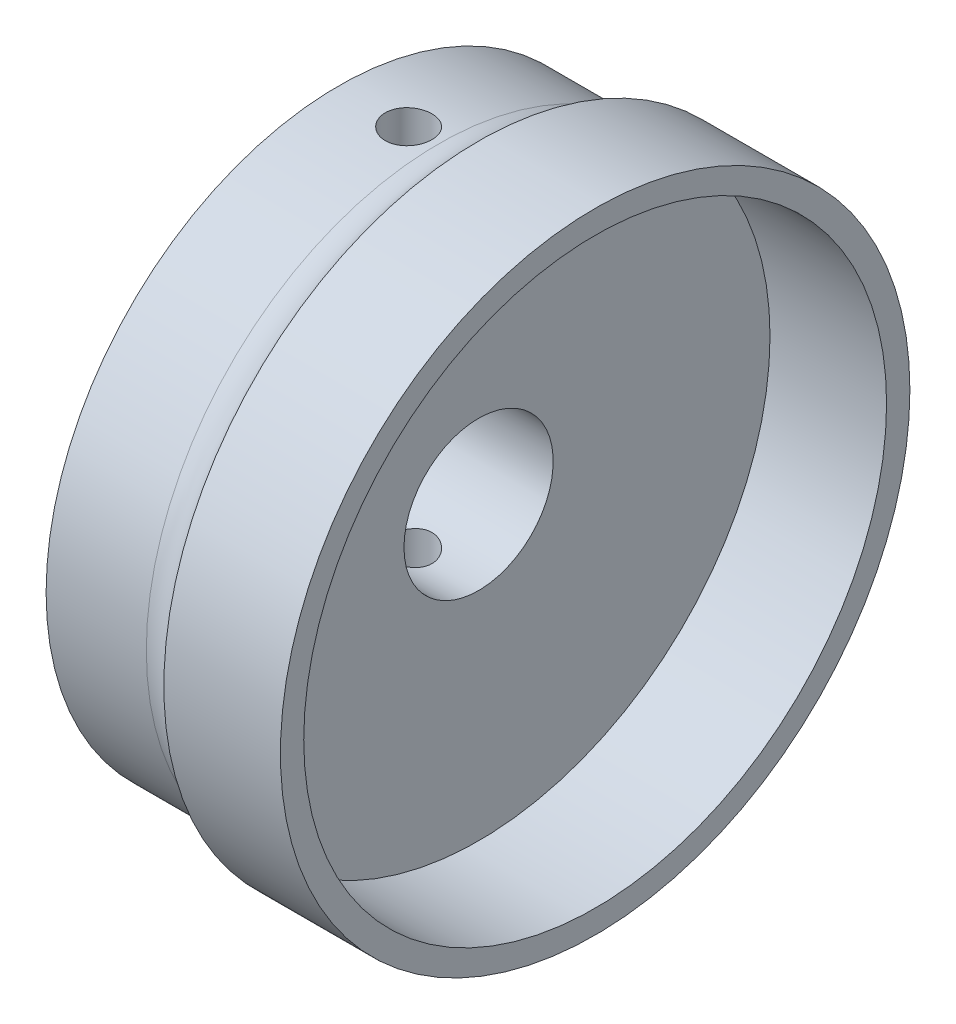
ISO-10303-21;
HEADER;
FILE_DESCRIPTION(('STEP AP214'),'2;1');
FILE_NAME('part.step','',(''),(''),'','','');
FILE_SCHEMA(('AUTOMOTIVE_DESIGN { 1 0 10303 214 1 1 1 1 }'));
ENDSEC;
DATA;
#1=APPLICATION_CONTEXT('core data for automotive mechanical design processes');
#2=APPLICATION_PROTOCOL_DEFINITION('international standard','automotive_design',2000,#1);
#3=PRODUCT_CONTEXT('',#1,'mechanical');
#4=PRODUCT('Part','Part','',(#3));
#5=PRODUCT_RELATED_PRODUCT_CATEGORY('part','',(#4));
#6=PRODUCT_DEFINITION_FORMATION('','',#4);
#7=PRODUCT_DEFINITION_CONTEXT('part definition',#1,'design');
#8=PRODUCT_DEFINITION('design','',#6,#7);
#9=PRODUCT_DEFINITION_SHAPE('','',#8);
#10=(LENGTH_UNIT() NAMED_UNIT(*) SI_UNIT(.MILLI.,.METRE.));
#11=(NAMED_UNIT(*) PLANE_ANGLE_UNIT() SI_UNIT($,.RADIAN.));
#12=(NAMED_UNIT(*) SI_UNIT($,.STERADIAN.) SOLID_ANGLE_UNIT());
#13=UNCERTAINTY_MEASURE_WITH_UNIT(LENGTH_MEASURE(1.E-05),#10,'distance_accuracy_value','');
#14=(GEOMETRIC_REPRESENTATION_CONTEXT(3) GLOBAL_UNCERTAINTY_ASSIGNED_CONTEXT((#13)) GLOBAL_UNIT_ASSIGNED_CONTEXT((#10,
#11,#12)) REPRESENTATION_CONTEXT('',''));
#15=CARTESIAN_POINT('',(0.,0.,0.));
#16=DIRECTION('',(0.,0.,1.));
#17=DIRECTION('',(1.,0.,0.));
#18=AXIS2_PLACEMENT_3D('',#15,#16,#17);
#19=CARTESIAN_POINT('',(6.,0.,0.));
#20=DIRECTION('',(-1.,0.,0.));
#21=DIRECTION('',(0.,0.,1.));
#22=AXIS2_PLACEMENT_3D('',#19,#20,#21);
#23=CYLINDRICAL_SURFACE('',#22,12.55);
#24=CARTESIAN_POINT('',(4.29779554694508,0.,0.));
#25=DIRECTION('',(1.,0.,0.));
#26=DIRECTION('',(0.,0.,-1.));
#27=AXIS2_PLACEMENT_3D('',#24,#25,#26);
#28=CIRCLE('',#27,12.55);
#29=CARTESIAN_POINT('',(4.29779554694508,0.,-12.55));
#30=VERTEX_POINT('',#29);
#31=EDGE_CURVE('E10',#30,#30,#28,.F.);
#32=ORIENTED_EDGE('',*,*,#31,.T.);
#33=EDGE_LOOP('',(#32));
#34=FACE_BOUND('',#33,.T.);
#35=CARTESIAN_POINT('',(3.,-12.5100959228936,1.));
#36=CARTESIAN_POINT('',(2.94392530500643,-12.5100964526146,0.999997546739263));
#37=CARTESIAN_POINT('',(2.88781222170895,-12.5104770009579,0.995267578739973));
#38=CARTESIAN_POINT('',(2.77713801171182,-12.5119580995085,0.976468119966159));
#39=CARTESIAN_POINT('',(2.72257872681765,-12.5130594698738,0.962387990224174));
#40=CARTESIAN_POINT('',(2.61663110486755,-12.5158566801776,0.92529745917909));
#41=CARTESIAN_POINT('',(2.56524101299843,-12.5175521875971,0.902292052289981));
#42=CARTESIAN_POINT('',(2.46706423308634,-12.5213462134671,0.848012739207154));
#43=CARTESIAN_POINT('',(2.42027655023429,-12.5234446445349,0.816740625271618));
#44=CARTESIAN_POINT('',(2.33250989618294,-12.5278136397397,0.746735746382406));
#45=CARTESIAN_POINT('',(2.29154326933219,-12.5300845544623,0.707987525551142));
#46=CARTESIAN_POINT('',(2.21668760732685,-12.5345394227661,0.624162947427995));
#47=CARTESIAN_POINT('',(2.18279887860581,-12.5367233725788,0.579086316292429));
#48=CARTESIAN_POINT('',(2.12302037670629,-12.5407615169639,0.483811425514187));
#49=CARTESIAN_POINT('',(2.09714121636063,-12.5426152726547,0.433606486854583));
#50=CARTESIAN_POINT('',(2.0541843562471,-12.545780394251,0.329546749074968));
#51=CARTESIAN_POINT('',(2.03710651417467,-12.5470917689259,0.275692008982886));
#52=CARTESIAN_POINT('',(2.01227241520281,-12.5490219255725,0.165983724330662));
#53=CARTESIAN_POINT('',(2.00449627552028,-12.5496421846377,0.110134706930862));
#54=CARTESIAN_POINT('',(1.99842486483701,-12.5501252240788,-0.00207903437516881));
#55=CARTESIAN_POINT('',(2.00012943111132,-12.5499880174557,-0.0584437494134892));
#56=CARTESIAN_POINT('',(2.01295475961754,-12.5489728062233,-0.169954111105816));
#57=CARTESIAN_POINT('',(2.02405414003361,-12.5480964837961,-0.22510223442625));
#58=CARTESIAN_POINT('',(2.05532079203876,-12.5457035602777,-0.332750208832182));
#59=CARTESIAN_POINT('',(2.07548814360931,-12.544186953539,-0.385250036554592));
#60=CARTESIAN_POINT('',(2.12434216635384,-12.540681212723,-0.486179301478755));
#61=CARTESIAN_POINT('',(2.15303843581175,-12.5386915467812,-0.534604073484158));
#62=CARTESIAN_POINT('',(2.21812874178935,-12.5344633477448,-0.625957702846895));
#63=CARTESIAN_POINT('',(2.25452292085044,-12.5322248100424,-0.668886458411425));
#64=CARTESIAN_POINT('',(2.33409650748329,-12.5277431693269,-0.748154439305018));
#65=CARTESIAN_POINT('',(2.3772944903858,-12.5255000709151,-0.784475020541218));
#66=CARTESIAN_POINT('',(2.46918465138687,-12.5212683907724,-0.849351662321607));
#67=CARTESIAN_POINT('',(2.51787683347141,-12.5192798092262,-0.877907717232668));
#68=CARTESIAN_POINT('',(2.61938604918242,-12.5157819109752,-0.926443874440319));
#69=CARTESIAN_POINT('',(2.67220353026282,-12.5142726463502,-0.946423044907074));
#70=CARTESIAN_POINT('',(2.78045796424647,-12.511905236907,-0.977224677627526));
#71=CARTESIAN_POINT('',(2.83589486683707,-12.5110470795881,-0.988047315680286));
#72=CARTESIAN_POINT('',(2.94765145087699,-12.5100810358463,-1.00020513989674));
#73=CARTESIAN_POINT('',(3.00396828865495,-12.5099710946849,-1.00156630920588));
#74=CARTESIAN_POINT('',(3.11602936930684,-12.510508505902,-0.994830585723685));
#75=CARTESIAN_POINT('',(3.17177361705309,-12.5111558518311,-0.986733773480174));
#76=CARTESIAN_POINT('',(3.28103276952536,-12.513133021653,-0.961333571720078));
#77=CARTESIAN_POINT('',(3.33455050354815,-12.5144619489041,-0.944042276737334));
#78=CARTESIAN_POINT('',(3.43792503807422,-12.5176517945726,-0.900756231934743));
#79=CARTESIAN_POINT('',(3.48778178478255,-12.5195127208053,-0.874761354254707));
#80=CARTESIAN_POINT('',(3.58253808468921,-12.5235618627505,-0.814740167453415));
#81=CARTESIAN_POINT('',(3.62742662800371,-12.525750781029,-0.780696524978534));
#82=CARTESIAN_POINT('',(3.71086109692741,-12.5302068745256,-0.705569253844884));
#83=CARTESIAN_POINT('',(3.74940692264158,-12.5324740509754,-0.664485514328466));
#84=CARTESIAN_POINT('',(3.81915029114155,-12.5368373019557,-0.576332072132416));
#85=CARTESIAN_POINT('',(3.85033096528159,-12.5389329766574,-0.529249001172143));
#86=CARTESIAN_POINT('',(3.90434324635684,-12.5427113392584,-0.43050013845374));
#87=CARTESIAN_POINT('',(3.92717493055428,-12.5443940309794,-0.378834389109589));
#88=CARTESIAN_POINT('',(3.96381208061402,-12.5471549822108,-0.272447522197831));
#89=CARTESIAN_POINT('',(3.97762802550909,-12.5482339432313,-0.217730032301262));
#90=CARTESIAN_POINT('',(3.99587577082367,-12.5496687028929,-0.106743026463964));
#91=CARTESIAN_POINT('',(4.00030773213065,-12.5500245139323,-0.0504735371488686));
#92=CARTESIAN_POINT('',(3.99965989608121,-12.549972906646,0.0618537800813963));
#93=CARTESIAN_POINT('',(3.99460640858337,-12.5495675994381,0.117911762587571));
#94=CARTESIAN_POINT('',(3.97518592916983,-12.5480434791887,0.22838023288578));
#95=CARTESIAN_POINT('',(3.96081892374793,-12.5469246651124,0.282790718288538));
#96=CARTESIAN_POINT('',(3.92318579172548,-12.5440991037119,0.38842179058771));
#97=CARTESIAN_POINT('',(3.89992007444345,-12.5423923834302,0.439642524078746));
#98=CARTESIAN_POINT('',(3.84515304072495,-12.5385820828605,0.537455128520954));
#99=CARTESIAN_POINT('',(3.81365187072517,-12.5364785096291,0.584047081757316));
#100=CARTESIAN_POINT('',(3.74320949239227,-12.5321037660722,0.671414075973546));
#101=CARTESIAN_POINT('',(3.70424886480198,-12.5298321680137,0.712173437989586));
#102=CARTESIAN_POINT('',(3.6200275296034,-12.5253810214819,0.786590062760005));
#103=CARTESIAN_POINT('',(3.57476529554233,-12.5232014954786,0.820245599753484));
#104=CARTESIAN_POINT('',(3.47914492174979,-12.5191771204791,0.87954064210122));
#105=CARTESIAN_POINT('',(3.42877801669107,-12.5173328628793,0.905166039214481));
#106=CARTESIAN_POINT('',(3.32447658732519,-12.5141951069137,0.947563707300988));
#107=CARTESIAN_POINT('',(3.27054626113747,-12.5129009733492,0.96434619410386));
#108=CARTESIAN_POINT('',(3.1802461590007,-12.5113440661914,0.984290108521158));
#109=CARTESIAN_POINT('',(3.14445775866029,-12.5108781522326,0.99017352871574));
#110=CARTESIAN_POINT('',(3.07245158102203,-12.5102539098106,0.998029262339193));
#111=CARTESIAN_POINT('',(3.03623380476254,-12.5100955806036,1.00000158522433));
#112=CARTESIAN_POINT('',(3.,-12.5100959228936,1.));
#113=B_SPLINE_CURVE_WITH_KNOTS('',3,(#35,#36,#37,#38,#39,#40,#41,#42,#43,#44,#45,#46,#47,#48,
#49,#50,#51,#52,#53,#54,#55,#56,#57,#58,#59,#60,#61,#62,#63,#64,#65,#66,#67,#68,#69,#70,#71,#72,
#73,#74,#75,#76,#77,#78,#79,#80,#81,#82,#83,#84,#85,#86,#87,#88,#89,#90,#91,#92,#93,#94,#95,#96,
#97,#98,#99,#100,#101,#102,#103,#104,#105,#106,#107,#108,#109,#110,#111,#112),.UNSPECIFIED.,.T.,
.F.,(4,2,2,2,2,2,2,2,2,2,2,2,2,2,2,2,2,2,2,2,2,2,2,2,2,2,2,2,2,2,2,2,2,2,2,2,2,2,4),(0.,
0.168091792669204,0.336375174999905,0.504564524684607,0.6727174400475,0.841221788503965,
1.00973343074828,1.17846740760405,1.34719865619037,1.51556858636902,1.68393562668851,
1.85192050477809,2.01990686456004,2.18808299350947,2.35626223683171,2.52490885658597,
2.69355559869229,2.86222065867616,3.03088248033453,3.19908093818539,3.3672779636037,
3.53525428596162,3.70323307608798,3.87157696471728,4.03992350443549,4.20865195406766,
4.37737884223343,4.54590926744373,4.71443680319305,4.88249758351709,5.05055860755888,
5.21861190214321,5.38666220873245,5.55515610128105,5.7236908797396,5.89252011988367,
6.06115388893741,6.16977008246983,6.27838601338946),.UNSPECIFIED.);
#114=CARTESIAN_POINT('',(3.,-12.5100959228936,1.));
#115=VERTEX_POINT('',#114);
#116=EDGE_CURVE('E56',#115,#115,#113,.T.);
#117=ORIENTED_EDGE('',*,*,#116,.F.);
#118=EDGE_LOOP('',(#117));
#119=FACE_BOUND('',#118,.T.);
#120=CARTESIAN_POINT('',(0.,0.,0.));
#121=DIRECTION('',(1.,0.,0.));
#122=DIRECTION('',(0.,0.,-1.));
#123=AXIS2_PLACEMENT_3D('',#120,#121,#122);
#124=CIRCLE('',#123,12.55);
#125=CARTESIAN_POINT('',(0.,0.,-12.55));
#126=VERTEX_POINT('',#125);
#127=EDGE_CURVE('E40',#126,#126,#124,.T.);
#128=ORIENTED_EDGE('',*,*,#127,.T.);
#129=EDGE_LOOP('',(#128));
#130=FACE_BOUND('',#129,.T.);
#131=CARTESIAN_POINT('',(3.,12.5100959228936,-1.));
#132=CARTESIAN_POINT('',(3.05607469499357,12.5100964526146,-0.999997546739263));
#133=CARTESIAN_POINT('',(3.11218777829105,12.5104770009579,-0.995267578739973));
#134=CARTESIAN_POINT('',(3.22286198828818,12.5119580995085,-0.976468119966159));
#135=CARTESIAN_POINT('',(3.27742127318235,12.5130594698738,-0.962387990224174));
#136=CARTESIAN_POINT('',(3.38336889513245,12.5158566801776,-0.92529745917909));
#137=CARTESIAN_POINT('',(3.43475898700157,12.5175521875971,-0.902292052289981));
#138=CARTESIAN_POINT('',(3.53293576691366,12.5213462134671,-0.848012739207154));
#139=CARTESIAN_POINT('',(3.57972344976571,12.5234446445349,-0.816740625271618));
#140=CARTESIAN_POINT('',(3.66749010381706,12.5278136397397,-0.746735746382406));
#141=CARTESIAN_POINT('',(3.70845673066781,12.5300845544623,-0.707987525551142));
#142=CARTESIAN_POINT('',(3.78331239267315,12.5345394227661,-0.624162947427995));
#143=CARTESIAN_POINT('',(3.81720112139419,12.5367233725788,-0.579086316292429));
#144=CARTESIAN_POINT('',(3.87697962329371,12.5407615169639,-0.483811425514186));
#145=CARTESIAN_POINT('',(3.90285878363937,12.5426152726547,-0.433606486854583));
#146=CARTESIAN_POINT('',(3.9458156437529,12.545780394251,-0.329546749074967));
#147=CARTESIAN_POINT('',(3.96289348582533,12.5470917689259,-0.275692008982885));
#148=CARTESIAN_POINT('',(3.98772758479719,12.5490219255725,-0.165983724330662));
#149=CARTESIAN_POINT('',(3.99550372447972,12.5496421846377,-0.110134706930861));
#150=CARTESIAN_POINT('',(4.00157513516299,12.5501252240788,0.002079034375169));
#151=CARTESIAN_POINT('',(3.99987056888868,12.5499880174557,0.0584437494134894));
#152=CARTESIAN_POINT('',(3.98704524038246,12.5489728062233,0.169954111105817));
#153=CARTESIAN_POINT('',(3.97594585996639,12.5480964837961,0.22510223442625));
#154=CARTESIAN_POINT('',(3.94467920796125,12.5457035602777,0.332750208832182));
#155=CARTESIAN_POINT('',(3.92451185639069,12.544186953539,0.385250036554592));
#156=CARTESIAN_POINT('',(3.87565783364616,12.540681212723,0.486179301478755));
#157=CARTESIAN_POINT('',(3.84696156418825,12.5386915467812,0.534604073484158));
#158=CARTESIAN_POINT('',(3.78187125821065,12.5344633477448,0.625957702846895));
#159=CARTESIAN_POINT('',(3.74547707914956,12.5322248100424,0.668886458411425));
#160=CARTESIAN_POINT('',(3.66590349251671,12.5277431693269,0.748154439305018));
#161=CARTESIAN_POINT('',(3.6227055096142,12.5255000709151,0.784475020541218));
#162=CARTESIAN_POINT('',(3.53081534861313,12.5212683907724,0.849351662321607));
#163=CARTESIAN_POINT('',(3.48212316652859,12.5192798092262,0.877907717232668));
#164=CARTESIAN_POINT('',(3.38061395081758,12.5157819109752,0.926443874440319));
#165=CARTESIAN_POINT('',(3.32779646973718,12.5142726463502,0.946423044907074));
#166=CARTESIAN_POINT('',(3.21954203575353,12.511905236907,0.977224677627526));
#167=CARTESIAN_POINT('',(3.16410513316293,12.5110470795881,0.988047315680286));
#168=CARTESIAN_POINT('',(3.05234854912301,12.5100810358463,1.00020513989674));
#169=CARTESIAN_POINT('',(2.99603171134505,12.5099710946849,1.00156630920588));
#170=CARTESIAN_POINT('',(2.88397063069316,12.510508505902,0.994830585723685));
#171=CARTESIAN_POINT('',(2.82822638294691,12.5111558518311,0.986733773480174));
#172=CARTESIAN_POINT('',(2.71896723047464,12.513133021653,0.961333571720078));
#173=CARTESIAN_POINT('',(2.66544949645185,12.5144619489041,0.944042276737334));
#174=CARTESIAN_POINT('',(2.56207496192578,12.5176517945726,0.900756231934743));
#175=CARTESIAN_POINT('',(2.51221821521745,12.5195127208053,0.874761354254707));
#176=CARTESIAN_POINT('',(2.41746191531079,12.5235618627505,0.814740167453415));
#177=CARTESIAN_POINT('',(2.37257337199629,12.525750781029,0.780696524978534));
#178=CARTESIAN_POINT('',(2.28913890307259,12.5302068745256,0.705569253844884));
#179=CARTESIAN_POINT('',(2.25059307735842,12.5324740509754,0.664485514328466));
#180=CARTESIAN_POINT('',(2.18084970885845,12.5368373019557,0.576332072132416));
#181=CARTESIAN_POINT('',(2.14966903471841,12.5389329766574,0.529249001172144));
#182=CARTESIAN_POINT('',(2.09565675364316,12.5427113392584,0.430500138453741));
#183=CARTESIAN_POINT('',(2.07282506944572,12.5443940309794,0.378834389109589));
#184=CARTESIAN_POINT('',(2.03618791938598,12.5471549822108,0.272447522197831));
#185=CARTESIAN_POINT('',(2.02237197449091,12.5482339432313,0.217730032301262));
#186=CARTESIAN_POINT('',(2.00412422917633,12.5496687028929,0.106743026463964));
#187=CARTESIAN_POINT('',(1.99969226786936,12.5500245139323,0.0504735371488685));
#188=CARTESIAN_POINT('',(2.00034010391879,12.549972906646,-0.0618537800813961));
#189=CARTESIAN_POINT('',(2.00539359141663,12.5495675994381,-0.117911762587571));
#190=CARTESIAN_POINT('',(2.02481407083017,12.5480434791887,-0.22838023288578));
#191=CARTESIAN_POINT('',(2.03918107625207,12.5469246651124,-0.282790718288537));
#192=CARTESIAN_POINT('',(2.07681420827452,12.5440991037119,-0.38842179058771));
#193=CARTESIAN_POINT('',(2.10007992555655,12.5423923834302,-0.439642524078746));
#194=CARTESIAN_POINT('',(2.15484695927505,12.5385820828605,-0.537455128520954));
#195=CARTESIAN_POINT('',(2.18634812927483,12.5364785096291,-0.584047081757316));
#196=CARTESIAN_POINT('',(2.25679050760773,12.5321037660722,-0.671414075973546));
#197=CARTESIAN_POINT('',(2.29575113519802,12.5298321680137,-0.712173437989586));
#198=CARTESIAN_POINT('',(2.37997247039661,12.5253810214819,-0.786590062760005));
#199=CARTESIAN_POINT('',(2.42523470445767,12.5232014954786,-0.820245599753484));
#200=CARTESIAN_POINT('',(2.52085507825021,12.5191771204791,-0.87954064210122));
#201=CARTESIAN_POINT('',(2.57122198330893,12.5173328628793,-0.905166039214482));
#202=CARTESIAN_POINT('',(2.67552341267481,12.5141951069137,-0.947563707300988));
#203=CARTESIAN_POINT('',(2.72945373886253,12.5129009733492,-0.96434619410386));
#204=CARTESIAN_POINT('',(2.8197538409993,12.5113440661914,-0.984290108521158));
#205=CARTESIAN_POINT('',(2.85554224133971,12.5108781522326,-0.99017352871574));
#206=CARTESIAN_POINT('',(2.92754841897797,12.5102539098106,-0.998029262339193));
#207=CARTESIAN_POINT('',(2.96376619523746,12.5100955806036,-1.00000158522433));
#208=CARTESIAN_POINT('',(3.,12.5100959228936,-1.));
#209=B_SPLINE_CURVE_WITH_KNOTS('',3,(#131,#132,#133,#134,#135,#136,#137,#138,#139,#140,#141,
#142,#143,#144,#145,#146,#147,#148,#149,#150,#151,#152,#153,#154,#155,#156,#157,#158,#159,#160,
#161,#162,#163,#164,#165,#166,#167,#168,#169,#170,#171,#172,#173,#174,#175,#176,#177,#178,#179,
#180,#181,#182,#183,#184,#185,#186,#187,#188,#189,#190,#191,#192,#193,#194,#195,#196,#197,#198,
#199,#200,#201,#202,#203,#204,#205,#206,#207,#208),.UNSPECIFIED.,.T.,.F.,(4,2,2,2,2,2,2,2,2,2,2,
2,2,2,2,2,2,2,2,2,2,2,2,2,2,2,2,2,2,2,2,2,2,2,2,2,2,2,4),(0.,0.168091792669204,
0.336375174999905,0.504564524684607,0.6727174400475,0.841221788503965,1.00973343074828,
1.17846740760405,1.34719865619037,1.51556858636902,1.68393562668851,1.85192050477809,
2.01990686456004,2.18808299350947,2.35626223683171,2.52490885658597,2.69355559869229,
2.86222065867617,3.03088248033453,3.19908093818539,3.3672779636037,3.53525428596162,
3.70323307608798,3.87157696471728,4.03992350443549,4.20865195406766,4.37737884223343,
4.54590926744373,4.71443680319305,4.88249758351709,5.05055860755888,5.21861190214321,
5.38666220873245,5.55515610128105,5.72369087973961,5.89252011988367,6.06115388893741,
6.16977008246983,6.27838601338946),.UNSPECIFIED.);
#210=CARTESIAN_POINT('',(3.,12.5100959228936,-1.));
#211=VERTEX_POINT('',#210);
#212=EDGE_CURVE('E48',#211,#211,#209,.T.);
#213=ORIENTED_EDGE('',*,*,#212,.T.);
#214=EDGE_LOOP('',(#213));
#215=FACE_BOUND('',#214,.T.);
#216=ADVANCED_FACE('F33',(#34,#119,#130,#215),#23,.T.);
#217=CARTESIAN_POINT('',(6.,0.,0.));
#218=DIRECTION('',(-1.,0.,0.));
#219=DIRECTION('',(0.,0.,1.));
#220=AXIS2_PLACEMENT_3D('',#217,#218,#219);
#221=CYLINDRICAL_SURFACE('',#220,3.2);
#222=CARTESIAN_POINT('',(3.,-3.03973683071413,1.));
#223=CARTESIAN_POINT('',(3.05467762887039,-3.0397371679444,0.99999963024345));
#224=CARTESIAN_POINT('',(3.10935901491222,-3.0412282529855,0.995500310344962));
#225=CARTESIAN_POINT('',(3.21711532865582,-3.04700511293903,0.977673403223082));
#226=CARTESIAN_POINT('',(3.27018981817649,-3.05129164307935,0.964343430262027));
#227=CARTESIAN_POINT('',(3.37315592156192,-3.06212751043461,0.929358305784155));
#228=CARTESIAN_POINT('',(3.42305298648892,-3.06867284148665,0.907717885892257));
#229=CARTESIAN_POINT('',(3.51852215668683,-3.0832832498174,0.856775313386413));
#230=CARTESIAN_POINT('',(3.56409349596691,-3.09134859550518,0.82747180724537));
#231=CARTESIAN_POINT('',(3.65118309399602,-3.10840102132993,0.760956856497509));
#232=CARTESIAN_POINT('',(3.69253088754912,-3.11740898707314,0.723527519776231));
#233=CARTESIAN_POINT('',(3.76847681056702,-3.13515396688779,0.642289637164482));
#234=CARTESIAN_POINT('',(3.80307399755579,-3.1438909429824,0.598480202014875));
#235=CARTESIAN_POINT('',(3.86528885040909,-3.16034842711921,0.504500729994665));
#236=CARTESIAN_POINT('',(3.89273096306519,-3.16804147650186,0.454209245216069));
#237=CARTESIAN_POINT('',(3.93870083988441,-3.18130041466453,0.349443386282729));
#238=CARTESIAN_POINT('',(3.95723069931966,-3.18686680335945,0.294969998789643));
#239=CARTESIAN_POINT('',(3.98428090247766,-3.1950974065668,0.185171485572876));
#240=CARTESIAN_POINT('',(3.99309259983028,-3.19784591187312,0.129924572374571));
#241=CARTESIAN_POINT('',(4.00137947715002,-3.20042876700814,0.0186726511876164));
#242=CARTESIAN_POINT('',(4.00085677948706,-3.20026377928052,-0.0373321815784669));
#243=CARTESIAN_POINT('',(3.99068136673124,-3.1970969290603,-0.146459584283788));
#244=CARTESIAN_POINT('',(3.98134449318958,-3.19419320777728,-0.199614907451236));
#245=CARTESIAN_POINT('',(3.9543240079656,-3.18599586048681,-0.303562450678217));
#246=CARTESIAN_POINT('',(3.93663985193076,-3.18070207861698,-0.354354516384957));
#247=CARTESIAN_POINT('',(3.89322384874009,-3.16818767783636,-0.452862482523825));
#248=CARTESIAN_POINT('',(3.86739615314957,-3.16094426893602,-0.500533124498266));
#249=CARTESIAN_POINT('',(3.80850312023636,-3.14529378362813,-0.590962008921623));
#250=CARTESIAN_POINT('',(3.77543595268975,-3.13688641315531,-0.633719004967068));
#251=CARTESIAN_POINT('',(3.70138109215895,-3.11938936587859,-0.714990158763107));
#252=CARTESIAN_POINT('',(3.66012074492698,-3.11028585591808,-0.75325323927535));
#253=CARTESIAN_POINT('',(3.57168391854049,-3.09272492351789,-0.822391794076293));
#254=CARTESIAN_POINT('',(3.52450674354023,-3.08426757725855,-0.853266398202702));
#255=CARTESIAN_POINT('',(3.42486602491189,-3.06888677321224,-0.907043720158153));
#256=CARTESIAN_POINT('',(3.37234927276522,-3.06198152291129,-0.929853445621562));
#257=CARTESIAN_POINT('',(3.26395240648459,-3.05070036263463,-0.966226767588001));
#258=CARTESIAN_POINT('',(3.20807350863485,-3.04632354398012,-0.979793686125952));
#259=CARTESIAN_POINT('',(3.09694403795316,-3.04079650741015,-0.996811881484679));
#260=CARTESIAN_POINT('',(3.04175840302105,-3.03952373212419,-1.00064763482981));
#261=CARTESIAN_POINT('',(2.93152820680351,-3.04000862071333,-0.999173955986524));
#262=CARTESIAN_POINT('',(2.87648362503608,-3.04176581633218,-0.993865936890527));
#263=CARTESIAN_POINT('',(2.76975336267354,-3.0479916596061,-0.974598988104683));
#264=CARTESIAN_POINT('',(2.71801658073943,-3.05238043274495,-0.960894649284177));
#265=CARTESIAN_POINT('',(2.61758256640454,-3.0632902987222,-0.925522989288344));
#266=CARTESIAN_POINT('',(2.56888583126342,-3.06981173931781,-0.90385436936927));
#267=CARTESIAN_POINT('',(2.47436871218222,-3.084484317206,-0.852460085246963));
#268=CARTESIAN_POINT('',(2.42867086752568,-3.0926768279127,-0.822521179908449));
#269=CARTESIAN_POINT('',(2.34280772291057,-3.10968279178779,-0.755685126943858));
#270=CARTESIAN_POINT('',(2.30264386485976,-3.11849640588703,-0.718786171752629));
#271=CARTESIAN_POINT('',(2.22727170726972,-3.13619350049997,-0.637258358202881));
#272=CARTESIAN_POINT('',(2.1923377710881,-3.14506473828504,-0.592372519830816));
#273=CARTESIAN_POINT('',(2.130487165343,-3.16151247874982,-0.497161236521119));
#274=CARTESIAN_POINT('',(2.10357012855117,-3.16908904072767,-0.446836040886898));
#275=CARTESIAN_POINT('',(2.05877555002265,-3.18205049542799,-0.342484418665465));
#276=CARTESIAN_POINT('',(2.04083256972505,-3.18745119648957,-0.288488147427004));
#277=CARTESIAN_POINT('',(2.01434196912824,-3.19552194118864,-0.178045803245111));
#278=CARTESIAN_POINT('',(2.0057914087332,-3.19819283931423,-0.121600502672285));
#279=CARTESIAN_POINT('',(1.9985671986003,-3.20044642723569,-0.0103879493191192));
#280=CARTESIAN_POINT('',(1.99949723986339,-3.20015303525912,0.0443513535572176));
#281=CARTESIAN_POINT('',(2.01024944883896,-3.19680782464839,0.152858577538598));
#282=CARTESIAN_POINT('',(2.02007103679356,-3.19375618586094,0.206626561743654));
#283=CARTESIAN_POINT('',(2.04807520737782,-3.18527656675837,0.311004094784633));
#284=CARTESIAN_POINT('',(2.0661516862763,-3.17987878368167,0.361644734759585));
#285=CARTESIAN_POINT('',(2.11005666176678,-3.16726356470358,0.459198740400073));
#286=CARTESIAN_POINT('',(2.13588648797875,-3.16004581673077,0.506111465019584));
#287=CARTESIAN_POINT('',(2.19557820667555,-3.1442391750671,0.596609355975752));
#288=CARTESIAN_POINT('',(2.22968281797116,-3.13561207800806,0.640027685642493));
#289=CARTESIAN_POINT('',(2.30452791155478,-3.11806989237613,0.720656633119451));
#290=CARTESIAN_POINT('',(2.34527037931156,-3.10915471827727,0.757865386803311));
#291=CARTESIAN_POINT('',(2.43385257587283,-3.09169514062089,0.826262927290038));
#292=CARTESIAN_POINT('',(2.48188272249307,-3.08317280691291,0.857211423957753));
#293=CARTESIAN_POINT('',(2.5827184962155,-3.06784100223099,0.910563765988107));
#294=CARTESIAN_POINT('',(2.63552218116091,-3.06103083887145,0.932971067228124));
#295=CARTESIAN_POINT('',(2.73977809385109,-3.05045248354059,0.96696944348656));
#296=CARTESIAN_POINT('',(2.79096203795892,-3.04647452041439,0.979319518703782));
#297=CARTESIAN_POINT('',(2.89476306567952,-3.04111685179481,0.995833966528002));
#298=CARTESIAN_POINT('',(2.94737979296986,-3.03973650617324,1.00000035584327));
#299=CARTESIAN_POINT('',(3.,-3.03973683071413,1.));
#300=B_SPLINE_CURVE_WITH_KNOTS('',3,(#222,#223,#224,#225,#226,#227,#228,#229,#230,#231,#232,
#233,#234,#235,#236,#237,#238,#239,#240,#241,#242,#243,#244,#245,#246,#247,#248,#249,#250,#251,
#252,#253,#254,#255,#256,#257,#258,#259,#260,#261,#262,#263,#264,#265,#266,#267,#268,#269,#270,
#271,#272,#273,#274,#275,#276,#277,#278,#279,#280,#281,#282,#283,#284,#285,#286,#287,#288,#289,
#290,#291,#292,#293,#294,#295,#296,#297,#298,#299),.UNSPECIFIED.,.T.,.F.,(4,2,2,2,2,2,2,2,2,2,2,
2,2,2,2,2,2,2,2,2,2,2,2,2,2,2,2,2,2,2,2,2,2,2,2,2,2,2,4),(0.,0.163838510014586,
0.327721301600959,0.491314915248035,0.654937443893129,0.823656644359877,0.992399383482153,
1.16495857566304,1.33747717929655,1.50466978263744,1.67182437172737,1.83320786371118,
1.99460188147392,2.15797123682044,2.32138194165867,2.49160271145184,2.66184351878338,
2.8339877674288,3.00607011157519,3.17123946622954,3.33638329765181,3.496751776254,
3.65714641792478,3.82214090637598,3.98717830399414,4.15905550239119,4.33092482643579,
4.50152191422708,4.67206558502378,4.8355104194153,4.99894459743755,5.16033477201717,
5.32175263919231,5.48864554474082,5.65558846207662,5.82806236391274,6.00046640632968,
6.15817883487019,6.31585239340933),.UNSPECIFIED.);
#301=CARTESIAN_POINT('',(3.,-3.03973683071413,1.));
#302=VERTEX_POINT('',#301);
#303=EDGE_CURVE('E65',#302,#302,#300,.T.);
#304=ORIENTED_EDGE('',*,*,#303,.F.);
#305=EDGE_LOOP('',(#304));
#306=FACE_BOUND('',#305,.T.);
#307=CARTESIAN_POINT('',(6.,0.,0.));
#308=DIRECTION('',(-1.,0.,0.));
#309=DIRECTION('',(0.,0.,1.));
#310=AXIS2_PLACEMENT_3D('',#307,#308,#309);
#311=CIRCLE('',#310,3.2);
#312=CARTESIAN_POINT('',(6.,0.,3.2));
#313=VERTEX_POINT('',#312);
#314=EDGE_CURVE('E51',#313,#313,#311,.T.);
#315=ORIENTED_EDGE('',*,*,#314,.F.);
#316=EDGE_LOOP('',(#315));
#317=FACE_BOUND('',#316,.T.);
#318=CARTESIAN_POINT('',(0.,0.,0.));
#319=DIRECTION('',(-1.,0.,0.));
#320=DIRECTION('',(0.,0.,1.));
#321=AXIS2_PLACEMENT_3D('',#318,#319,#320);
#322=CIRCLE('',#321,3.2);
#323=CARTESIAN_POINT('',(0.,0.,3.2));
#324=VERTEX_POINT('',#323);
#325=EDGE_CURVE('E44',#324,#324,#322,.T.);
#326=ORIENTED_EDGE('',*,*,#325,.T.);
#327=EDGE_LOOP('',(#326));
#328=FACE_BOUND('',#327,.T.);
#329=CARTESIAN_POINT('',(3.,3.03973683071413,-1.));
#330=CARTESIAN_POINT('',(2.94532237112961,3.0397371679444,-0.99999963024345));
#331=CARTESIAN_POINT('',(2.89064098508778,3.0412282529855,-0.995500310344962));
#332=CARTESIAN_POINT('',(2.78288467134418,3.04700511293903,-0.977673403223082));
#333=CARTESIAN_POINT('',(2.72981018182351,3.05129164307935,-0.964343430262026));
#334=CARTESIAN_POINT('',(2.62684407843808,3.06212751043461,-0.929358305784155));
#335=CARTESIAN_POINT('',(2.57694701351108,3.06867284148665,-0.907717885892257));
#336=CARTESIAN_POINT('',(2.48147784331317,3.0832832498174,-0.856775313386413));
#337=CARTESIAN_POINT('',(2.43590650403309,3.09134859550518,-0.827471807245369));
#338=CARTESIAN_POINT('',(2.34881690600398,3.10840102132993,-0.760956856497509));
#339=CARTESIAN_POINT('',(2.30746911245088,3.11740898707314,-0.723527519776231));
#340=CARTESIAN_POINT('',(2.23152318943298,3.13515396688779,-0.642289637164482));
#341=CARTESIAN_POINT('',(2.19692600244421,3.1438909429824,-0.598480202014875));
#342=CARTESIAN_POINT('',(2.13471114959091,3.16034842711921,-0.504500729994665));
#343=CARTESIAN_POINT('',(2.10726903693481,3.16804147650186,-0.454209245216069));
#344=CARTESIAN_POINT('',(2.06129916011558,3.18130041466453,-0.349443386282729));
#345=CARTESIAN_POINT('',(2.04276930068034,3.18686680335945,-0.294969998789643));
#346=CARTESIAN_POINT('',(2.01571909752234,3.1950974065668,-0.185171485572876));
#347=CARTESIAN_POINT('',(2.00690740016972,3.19784591187312,-0.129924572374572));
#348=CARTESIAN_POINT('',(1.99862052284998,3.20042876700814,-0.0186726511876166));
#349=CARTESIAN_POINT('',(1.99914322051294,3.20026377928052,0.0373321815784667));
#350=CARTESIAN_POINT('',(2.00931863326876,3.1970969290603,0.146459584283788));
#351=CARTESIAN_POINT('',(2.01865550681042,3.19419320777728,0.199614907451235));
#352=CARTESIAN_POINT('',(2.0456759920344,3.18599586048681,0.303562450678216));
#353=CARTESIAN_POINT('',(2.06336014806924,3.18070207861698,0.354354516384956));
#354=CARTESIAN_POINT('',(2.10677615125991,3.16818767783636,0.452862482523825));
#355=CARTESIAN_POINT('',(2.13260384685043,3.16094426893602,0.500533124498265));
#356=CARTESIAN_POINT('',(2.19149687976364,3.14529378362813,0.590962008921623));
#357=CARTESIAN_POINT('',(2.22456404731025,3.13688641315531,0.633719004967068));
#358=CARTESIAN_POINT('',(2.29861890784105,3.11938936587859,0.714990158763107));
#359=CARTESIAN_POINT('',(2.33987925507302,3.11028585591808,0.75325323927535));
#360=CARTESIAN_POINT('',(2.42831608145951,3.09272492351789,0.822391794076293));
#361=CARTESIAN_POINT('',(2.47549325645977,3.08426757725855,0.853266398202702));
#362=CARTESIAN_POINT('',(2.57513397508811,3.06888677321224,0.907043720158153));
#363=CARTESIAN_POINT('',(2.62765072723478,3.06198152291129,0.929853445621562));
#364=CARTESIAN_POINT('',(2.73604759351541,3.05070036263463,0.966226767588001));
#365=CARTESIAN_POINT('',(2.79192649136515,3.04632354398012,0.979793686125952));
#366=CARTESIAN_POINT('',(2.90305596204684,3.04079650741015,0.996811881484679));
#367=CARTESIAN_POINT('',(2.95824159697895,3.03952373212419,1.00064763482981));
#368=CARTESIAN_POINT('',(3.06847179319649,3.04000862071333,0.999173955986524));
#369=CARTESIAN_POINT('',(3.12351637496392,3.04176581633218,0.993865936890527));
#370=CARTESIAN_POINT('',(3.23024663732646,3.0479916596061,0.974598988104683));
#371=CARTESIAN_POINT('',(3.28198341926057,3.05238043274495,0.960894649284177));
#372=CARTESIAN_POINT('',(3.38241743359546,3.0632902987222,0.925522989288344));
#373=CARTESIAN_POINT('',(3.43111416873658,3.06981173931781,0.90385436936927));
#374=CARTESIAN_POINT('',(3.52563128781778,3.084484317206,0.852460085246963));
#375=CARTESIAN_POINT('',(3.57132913247432,3.0926768279127,0.822521179908449));
#376=CARTESIAN_POINT('',(3.65719227708943,3.10968279178779,0.755685126943858));
#377=CARTESIAN_POINT('',(3.69735613514024,3.11849640588703,0.718786171752629));
#378=CARTESIAN_POINT('',(3.77272829273028,3.13619350049997,0.637258358202881));
#379=CARTESIAN_POINT('',(3.8076622289119,3.14506473828504,0.592372519830816));
#380=CARTESIAN_POINT('',(3.869512834657,3.16151247874982,0.497161236521119));
#381=CARTESIAN_POINT('',(3.89642987144883,3.16908904072767,0.446836040886898));
#382=CARTESIAN_POINT('',(3.94122444997735,3.18205049542799,0.342484418665465));
#383=CARTESIAN_POINT('',(3.95916743027495,3.18745119648957,0.288488147427004));
#384=CARTESIAN_POINT('',(3.98565803087177,3.19552194118864,0.178045803245112));
#385=CARTESIAN_POINT('',(3.9942085912668,3.19819283931423,0.121600502672285));
#386=CARTESIAN_POINT('',(4.0014328013997,3.20044642723569,0.0103879493191189));
#387=CARTESIAN_POINT('',(4.00050276013661,3.20015303525912,-0.0443513535572179));
#388=CARTESIAN_POINT('',(3.98975055116104,3.19680782464839,-0.152858577538598));
#389=CARTESIAN_POINT('',(3.97992896320644,3.19375618586094,-0.206626561743655));
#390=CARTESIAN_POINT('',(3.95192479262218,3.18527656675837,-0.311004094784633));
#391=CARTESIAN_POINT('',(3.9338483137237,3.17987878368167,-0.361644734759584));
#392=CARTESIAN_POINT('',(3.88994333823322,3.16726356470358,-0.459198740400072));
#393=CARTESIAN_POINT('',(3.86411351202125,3.16004581673077,-0.506111465019584));
#394=CARTESIAN_POINT('',(3.80442179332445,3.1442391750671,-0.596609355975752));
#395=CARTESIAN_POINT('',(3.77031718202884,3.13561207800806,-0.640027685642493));
#396=CARTESIAN_POINT('',(3.69547208844522,3.11806989237613,-0.72065663311945));
#397=CARTESIAN_POINT('',(3.65472962068844,3.10915471827727,-0.757865386803311));
#398=CARTESIAN_POINT('',(3.56614742412717,3.09169514062089,-0.826262927290038));
#399=CARTESIAN_POINT('',(3.51811727750693,3.08317280691291,-0.857211423957753));
#400=CARTESIAN_POINT('',(3.4172815037845,3.06784100223099,-0.910563765988108));
#401=CARTESIAN_POINT('',(3.36447781883909,3.06103083887145,-0.932971067228124));
#402=CARTESIAN_POINT('',(3.26022190614891,3.05045248354059,-0.96696944348656));
#403=CARTESIAN_POINT('',(3.20903796204108,3.04647452041439,-0.979319518703781));
#404=CARTESIAN_POINT('',(3.10523693432048,3.0411168517948,-0.995833966528002));
#405=CARTESIAN_POINT('',(3.05262020703014,3.03973650617324,-1.00000035584327));
#406=CARTESIAN_POINT('',(3.,3.03973683071413,-1.));
#407=B_SPLINE_CURVE_WITH_KNOTS('',3,(#329,#330,#331,#332,#333,#334,#335,#336,#337,#338,#339,
#340,#341,#342,#343,#344,#345,#346,#347,#348,#349,#350,#351,#352,#353,#354,#355,#356,#357,#358,
#359,#360,#361,#362,#363,#364,#365,#366,#367,#368,#369,#370,#371,#372,#373,#374,#375,#376,#377,
#378,#379,#380,#381,#382,#383,#384,#385,#386,#387,#388,#389,#390,#391,#392,#393,#394,#395,#396,
#397,#398,#399,#400,#401,#402,#403,#404,#405,#406),.UNSPECIFIED.,.T.,.F.,(4,2,2,2,2,2,2,2,2,2,2,
2,2,2,2,2,2,2,2,2,2,2,2,2,2,2,2,2,2,2,2,2,2,2,2,2,2,2,4),(0.,0.163838510014587,
0.327721301600959,0.491314915248036,0.654937443893129,0.823656644359877,0.992399383482153,
1.16495857566304,1.33747717929655,1.50466978263744,1.67182437172737,1.83320786371117,
1.99460188147392,2.15797123682044,2.32138194165867,2.49160271145184,2.66184351878338,
2.8339877674288,3.00607011157519,3.17123946622954,3.33638329765181,3.496751776254,
3.65714641792478,3.82214090637598,3.98717830399414,4.15905550239119,4.33092482643579,
4.50152191422708,4.67206558502378,4.8355104194153,4.99894459743755,5.16033477201717,
5.32175263919231,5.48864554474082,5.65558846207662,5.82806236391273,6.00046640632967,
6.15817883487019,6.31585239340933),.UNSPECIFIED.);
#408=CARTESIAN_POINT('',(3.,3.03973683071413,-1.));
#409=VERTEX_POINT('',#408);
#410=EDGE_CURVE('E64',#409,#409,#407,.T.);
#411=ORIENTED_EDGE('',*,*,#410,.T.);
#412=EDGE_LOOP('',(#411));
#413=FACE_BOUND('',#412,.T.);
#414=ADVANCED_FACE('F100',(#306,#317,#328,#413),#221,.F.);
#415=CARTESIAN_POINT('',(0.,0.,0.));
#416=DIRECTION('',(1.,0.,0.));
#417=DIRECTION('',(0.,0.,-1.));
#418=AXIS2_PLACEMENT_3D('',#415,#416,#417);
#419=PLANE('',#418);
#420=ORIENTED_EDGE('',*,*,#325,.F.);
#421=EDGE_LOOP('',(#420));
#422=FACE_BOUND('',#421,.T.);
#423=ORIENTED_EDGE('',*,*,#127,.F.);
#424=EDGE_LOOP('',(#423));
#425=FACE_BOUND('',#424,.T.);
#426=ADVANCED_FACE('F103',(#422,#425),#419,.F.);
#427=CARTESIAN_POINT('',(3.,-12.551,0.));
#428=DIRECTION('',(0.,1.,0.));
#429=DIRECTION('',(0.,0.,1.));
#430=AXIS2_PLACEMENT_3D('',#427,#428,#429);
#431=CYLINDRICAL_SURFACE('',#430,1.);
#432=ORIENTED_EDGE('',*,*,#303,.T.);
#433=EDGE_LOOP('',(#432));
#434=FACE_BOUND('',#433,.T.);
#435=ORIENTED_EDGE('',*,*,#116,.T.);
#436=EDGE_LOOP('',(#435));
#437=FACE_BOUND('',#436,.T.);
#438=ADVANCED_FACE('F71',(#434,#437),#431,.F.);
#439=CARTESIAN_POINT('',(3.,12.551,0.));
#440=DIRECTION('',(0.,-1.,0.));
#441=DIRECTION('',(0.,0.,-1.));
#442=AXIS2_PLACEMENT_3D('',#439,#440,#441);
#443=CYLINDRICAL_SURFACE('',#442,1.);
#444=ORIENTED_EDGE('',*,*,#410,.F.);
#445=EDGE_LOOP('',(#444));
#446=FACE_BOUND('',#445,.T.);
#447=ORIENTED_EDGE('',*,*,#212,.F.);
#448=EDGE_LOOP('',(#447));
#449=FACE_BOUND('',#448,.T.);
#450=ADVANCED_FACE('F77',(#446,#449),#443,.F.);
#451=CARTESIAN_POINT('',(11.,0.,0.));
#452=DIRECTION('',(1.,0.,0.));
#453=DIRECTION('',(0.,0.,-1.));
#454=AXIS2_PLACEMENT_3D('',#451,#452,#453);
#455=PLANE('',#454);
#456=CARTESIAN_POINT('',(11.,0.,0.));
#457=DIRECTION('',(1.,0.,0.));
#458=DIRECTION('',(0.,0.,-1.));
#459=AXIS2_PLACEMENT_3D('',#456,#457,#458);
#460=CIRCLE('',#459,12.5);
#461=CARTESIAN_POINT('',(11.,0.,-12.5));
#462=VERTEX_POINT('',#461);
#463=EDGE_CURVE('E143',#462,#462,#460,.T.);
#464=ORIENTED_EDGE('',*,*,#463,.F.);
#465=EDGE_LOOP('',(#464));
#466=FACE_BOUND('',#465,.T.);
#467=CARTESIAN_POINT('',(11.,0.,0.));
#468=DIRECTION('',(1.,0.,0.));
#469=DIRECTION('',(0.,0.,-1.));
#470=AXIS2_PLACEMENT_3D('',#467,#468,#469);
#471=CIRCLE('',#470,13.5);
#472=CARTESIAN_POINT('',(11.,0.,-13.5));
#473=VERTEX_POINT('',#472);
#474=EDGE_CURVE('E146',#473,#473,#471,.T.);
#475=ORIENTED_EDGE('',*,*,#474,.T.);
#476=EDGE_LOOP('',(#475));
#477=FACE_BOUND('',#476,.T.);
#478=ADVANCED_FACE('F81',(#466,#477),#455,.T.);
#479=CARTESIAN_POINT('',(11.,0.,0.));
#480=DIRECTION('',(-1.,0.,0.));
#481=DIRECTION('',(0.,0.,1.));
#482=AXIS2_PLACEMENT_3D('',#479,#480,#481);
#483=CYLINDRICAL_SURFACE('',#482,13.5);
#484=ORIENTED_EDGE('',*,*,#474,.F.);
#485=EDGE_LOOP('',(#484));
#486=FACE_BOUND('',#485,.T.);
#487=CARTESIAN_POINT('',(6.,0.,0.));
#488=DIRECTION('',(1.,0.,0.));
#489=DIRECTION('',(0.,0.,-1.));
#490=AXIS2_PLACEMENT_3D('',#487,#488,#489);
#491=CIRCLE('',#490,13.5);
#492=CARTESIAN_POINT('',(6.,0.,-13.5));
#493=VERTEX_POINT('',#492);
#494=EDGE_CURVE('E54',#493,#493,#491,.T.);
#495=ORIENTED_EDGE('',*,*,#494,.T.);
#496=EDGE_LOOP('',(#495));
#497=FACE_BOUND('',#496,.T.);
#498=ADVANCED_FACE('F122',(#486,#497),#483,.T.);
#499=CARTESIAN_POINT('',(6.,0.,0.));
#500=DIRECTION('',(1.,0.,0.));
#501=DIRECTION('',(0.,0.,-1.));
#502=AXIS2_PLACEMENT_3D('',#499,#500,#501);
#503=PLANE('',#502);
#504=CARTESIAN_POINT('',(6.,0.,0.));
#505=DIRECTION('',(1.,0.,0.));
#506=DIRECTION('',(0.,0.,-1.));
#507=AXIS2_PLACEMENT_3D('',#504,#505,#506);
#508=CIRCLE('',#507,12.5);
#509=CARTESIAN_POINT('',(6.,0.,-12.5));
#510=VERTEX_POINT('',#509);
#511=EDGE_CURVE('E55',#510,#510,#508,.T.);
#512=ORIENTED_EDGE('',*,*,#511,.T.);
#513=EDGE_LOOP('',(#512));
#514=FACE_BOUND('',#513,.T.);
#515=ORIENTED_EDGE('',*,*,#314,.T.);
#516=EDGE_LOOP('',(#515));
#517=FACE_BOUND('',#516,.T.);
#518=ADVANCED_FACE('F119',(#514,#517),#503,.T.);
#519=CARTESIAN_POINT('',(6.,0.,0.));
#520=DIRECTION('',(1.,0.,0.));
#521=DIRECTION('',(0.,0.,-1.));
#522=AXIS2_PLACEMENT_3D('',#519,#520,#521);
#523=CYLINDRICAL_SURFACE('',#522,12.5);
#524=ORIENTED_EDGE('',*,*,#511,.F.);
#525=EDGE_LOOP('',(#524));
#526=FACE_BOUND('',#525,.T.);
#527=ORIENTED_EDGE('',*,*,#463,.T.);
#528=EDGE_LOOP('',(#527));
#529=FACE_BOUND('',#528,.T.);
#530=ADVANCED_FACE('F121',(#526,#529),#523,.F.);
#531=CARTESIAN_POINT('',(4.29779554694508,0.,0.));
#532=DIRECTION('',(1.,0.,0.));
#533=DIRECTION('',(0.,0.,-1.));
#534=AXIS2_PLACEMENT_3D('',#531,#532,#533);
#535=TOROIDAL_SURFACE('',#534,14.55,2.);
#536=ORIENTED_EDGE('',*,*,#31,.F.);
#537=EDGE_LOOP('',(#536));
#538=FACE_BOUND('',#537,.T.);
#539=ORIENTED_EDGE('',*,*,#494,.F.);
#540=EDGE_LOOP('',(#539));
#541=FACE_BOUND('',#540,.T.);
#542=ADVANCED_FACE('F35',(#538,#541),#535,.F.);
#543=CLOSED_SHELL('',(#216,#414,#426,#438,#450,#478,#498,#518,#530,#542));
#544=MANIFOLD_SOLID_BREP('B2',#543);
#545=ADVANCED_BREP_SHAPE_REPRESENTATION('',(#18,#544),#14);
#546=SHAPE_DEFINITION_REPRESENTATION(#9,#545);
ENDSEC;
END-ISO-10303-21;
